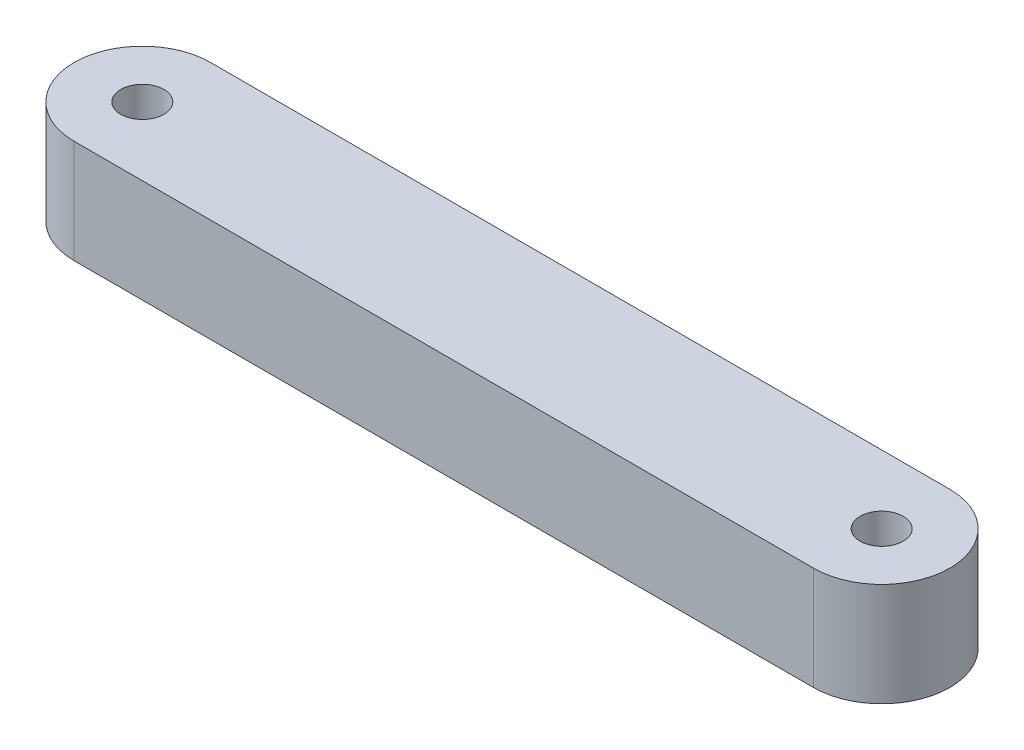
ISO-10303-21;
HEADER;
FILE_DESCRIPTION(('STEP AP214'),'2;1');
FILE_NAME('part.step','',(''),(''),'','','');
FILE_SCHEMA(('AUTOMOTIVE_DESIGN { 1 0 10303 214 1 1 1 1 }'));
ENDSEC;
DATA;
#1=APPLICATION_CONTEXT('core data for automotive mechanical design processes');
#2=APPLICATION_PROTOCOL_DEFINITION('international standard','automotive_design',2000,#1);
#3=PRODUCT_CONTEXT('',#1,'mechanical');
#4=PRODUCT('Part','Part','',(#3));
#5=PRODUCT_RELATED_PRODUCT_CATEGORY('part','',(#4));
#6=PRODUCT_DEFINITION_FORMATION('','',#4);
#7=PRODUCT_DEFINITION_CONTEXT('part definition',#1,'design');
#8=PRODUCT_DEFINITION('design','',#6,#7);
#9=PRODUCT_DEFINITION_SHAPE('','',#8);
#10=(LENGTH_UNIT() NAMED_UNIT(*) SI_UNIT(.MILLI.,.METRE.));
#11=(NAMED_UNIT(*) PLANE_ANGLE_UNIT() SI_UNIT($,.RADIAN.));
#12=(NAMED_UNIT(*) SI_UNIT($,.STERADIAN.) SOLID_ANGLE_UNIT());
#13=UNCERTAINTY_MEASURE_WITH_UNIT(LENGTH_MEASURE(1.E-05),#10,'distance_accuracy_value','');
#14=(GEOMETRIC_REPRESENTATION_CONTEXT(3) GLOBAL_UNCERTAINTY_ASSIGNED_CONTEXT((#13)) GLOBAL_UNIT_ASSIGNED_CONTEXT((#10,
#11,#12)) REPRESENTATION_CONTEXT('',''));
#15=CARTESIAN_POINT('',(0.,0.,0.));
#16=DIRECTION('',(0.,0.,1.));
#17=DIRECTION('',(1.,0.,0.));
#18=AXIS2_PLACEMENT_3D('',#15,#16,#17);
#19=CARTESIAN_POINT('',(0.,12.7,0.));
#20=DIRECTION('',(0.,1.,0.));
#21=DIRECTION('',(0.,0.,1.));
#22=AXIS2_PLACEMENT_3D('',#19,#20,#21);
#23=PLANE('',#22);
#24=CARTESIAN_POINT('',(0.,12.7,0.));
#25=DIRECTION('',(0.,1.,0.));
#26=DIRECTION('',(0.,0.,1.));
#27=AXIS2_PLACEMENT_3D('',#24,#25,#26);
#28=CIRCLE('',#27,2.65);
#29=CARTESIAN_POINT('',(0.,12.7,2.65));
#30=VERTEX_POINT('',#29);
#31=EDGE_CURVE('E113',#30,#30,#28,.T.);
#32=ORIENTED_EDGE('',*,*,#31,.F.);
#33=EDGE_LOOP('',(#32));
#34=FACE_BOUND('',#33,.T.);
#35=CARTESIAN_POINT('',(0.,12.7,0.));
#36=DIRECTION('',(0.,1.,0.));
#37=DIRECTION('',(0.,0.,1.));
#38=AXIS2_PLACEMENT_3D('',#35,#36,#37);
#39=CIRCLE('',#38,8.382);
#40=CARTESIAN_POINT('',(0.,12.7,-8.382));
#41=VERTEX_POINT('',#40);
#42=CARTESIAN_POINT('',(0.,12.7,8.382));
#43=VERTEX_POINT('',#42);
#44=EDGE_CURVE('E93',#41,#43,#39,.T.);
#45=ORIENTED_EDGE('',*,*,#44,.T.);
#46=DIRECTION('',(1.,0.,0.));
#47=VECTOR('',#46,1.);
#48=CARTESIAN_POINT('',(0.,12.7,8.382));
#49=LINE('',#48,#47);
#50=CARTESIAN_POINT('',(90.805,12.7,8.382));
#51=VERTEX_POINT('',#50);
#52=EDGE_CURVE('E88',#43,#51,#49,.T.);
#53=ORIENTED_EDGE('',*,*,#52,.T.);
#54=CARTESIAN_POINT('',(90.805,12.7,0.));
#55=DIRECTION('',(0.,1.,0.));
#56=DIRECTION('',(0.,0.,1.));
#57=AXIS2_PLACEMENT_3D('',#54,#55,#56);
#58=CIRCLE('',#57,8.382);
#59=CARTESIAN_POINT('',(90.805,12.7,-8.382));
#60=VERTEX_POINT('',#59);
#61=EDGE_CURVE('E91',#51,#60,#58,.T.);
#62=ORIENTED_EDGE('',*,*,#61,.T.);
#63=DIRECTION('',(-1.,0.,0.));
#64=VECTOR('',#63,1.);
#65=CARTESIAN_POINT('',(0.,12.7,-8.382));
#66=LINE('',#65,#64);
#67=EDGE_CURVE('E58',#60,#41,#66,.T.);
#68=ORIENTED_EDGE('',*,*,#67,.T.);
#69=EDGE_LOOP('',(#45,#53,#62,#68));
#70=FACE_BOUND('',#69,.T.);
#71=CARTESIAN_POINT('',(90.805,12.7,0.));
#72=DIRECTION('',(0.,1.,0.));
#73=DIRECTION('',(0.,0.,1.));
#74=AXIS2_PLACEMENT_3D('',#71,#72,#73);
#75=CIRCLE('',#74,2.65);
#76=CARTESIAN_POINT('',(90.805,12.7,2.65));
#77=VERTEX_POINT('',#76);
#78=EDGE_CURVE('E135',#77,#77,#75,.T.);
#79=ORIENTED_EDGE('',*,*,#78,.F.);
#80=EDGE_LOOP('',(#79));
#81=FACE_BOUND('',#80,.T.);
#82=ADVANCED_FACE('F40',(#34,#70,#81),#23,.T.);
#83=CARTESIAN_POINT('',(0.,0.,0.));
#84=DIRECTION('',(0.,1.,0.));
#85=DIRECTION('',(0.,0.,1.));
#86=AXIS2_PLACEMENT_3D('',#83,#84,#85);
#87=PLANE('',#86);
#88=CARTESIAN_POINT('',(0.,0.,0.));
#89=DIRECTION('',(0.,1.,0.));
#90=DIRECTION('',(0.,0.,1.));
#91=AXIS2_PLACEMENT_3D('',#88,#89,#90);
#92=CIRCLE('',#91,8.382);
#93=CARTESIAN_POINT('',(0.,0.,-8.382));
#94=VERTEX_POINT('',#93);
#95=CARTESIAN_POINT('',(0.,0.,8.382));
#96=VERTEX_POINT('',#95);
#97=EDGE_CURVE('E109',#94,#96,#92,.T.);
#98=ORIENTED_EDGE('',*,*,#97,.F.);
#99=DIRECTION('',(-1.,0.,0.));
#100=VECTOR('',#99,1.);
#101=CARTESIAN_POINT('',(0.,0.,-8.382));
#102=LINE('',#101,#100);
#103=CARTESIAN_POINT('',(90.805,0.,-8.382));
#104=VERTEX_POINT('',#103);
#105=EDGE_CURVE('E81',#104,#94,#102,.T.);
#106=ORIENTED_EDGE('',*,*,#105,.F.);
#107=CARTESIAN_POINT('',(90.805,0.,0.));
#108=DIRECTION('',(0.,1.,0.));
#109=DIRECTION('',(0.,0.,1.));
#110=AXIS2_PLACEMENT_3D('',#107,#108,#109);
#111=CIRCLE('',#110,8.382);
#112=CARTESIAN_POINT('',(90.805,0.,8.382));
#113=VERTEX_POINT('',#112);
#114=EDGE_CURVE('E75',#113,#104,#111,.T.);
#115=ORIENTED_EDGE('',*,*,#114,.F.);
#116=DIRECTION('',(1.,0.,0.));
#117=VECTOR('',#116,1.);
#118=CARTESIAN_POINT('',(0.,0.,8.382));
#119=LINE('',#118,#117);
#120=EDGE_CURVE('E98',#96,#113,#119,.T.);
#121=ORIENTED_EDGE('',*,*,#120,.F.);
#122=EDGE_LOOP('',(#98,#106,#115,#121));
#123=FACE_BOUND('',#122,.T.);
#124=CARTESIAN_POINT('',(0.,0.,0.));
#125=DIRECTION('',(0.,1.,0.));
#126=DIRECTION('',(0.,0.,1.));
#127=AXIS2_PLACEMENT_3D('',#124,#125,#126);
#128=CIRCLE('',#127,2.65);
#129=CARTESIAN_POINT('',(0.,0.,2.65));
#130=VERTEX_POINT('',#129);
#131=EDGE_CURVE('E131',#130,#130,#128,.T.);
#132=ORIENTED_EDGE('',*,*,#131,.T.);
#133=EDGE_LOOP('',(#132));
#134=FACE_BOUND('',#133,.T.);
#135=CARTESIAN_POINT('',(90.805,0.,0.));
#136=DIRECTION('',(0.,1.,0.));
#137=DIRECTION('',(0.,0.,1.));
#138=AXIS2_PLACEMENT_3D('',#135,#136,#137);
#139=CIRCLE('',#138,2.65);
#140=CARTESIAN_POINT('',(90.805,0.,2.65));
#141=VERTEX_POINT('',#140);
#142=EDGE_CURVE('E139',#141,#141,#139,.T.);
#143=ORIENTED_EDGE('',*,*,#142,.T.);
#144=EDGE_LOOP('',(#143));
#145=FACE_BOUND('',#144,.T.);
#146=ADVANCED_FACE('F126',(#123,#134,#145),#87,.F.);
#147=CARTESIAN_POINT('',(0.,12.7,0.));
#148=DIRECTION('',(0.,-1.,0.));
#149=DIRECTION('',(0.,0.,-1.));
#150=AXIS2_PLACEMENT_3D('',#147,#148,#149);
#151=CYLINDRICAL_SURFACE('',#150,8.382);
#152=ORIENTED_EDGE('',*,*,#97,.T.);
#153=DIRECTION('',(0.,-1.,0.));
#154=VECTOR('',#153,1.);
#155=CARTESIAN_POINT('',(0.,12.7,8.382));
#156=LINE('',#155,#154);
#157=EDGE_CURVE('E11',#43,#96,#156,.T.);
#158=ORIENTED_EDGE('',*,*,#157,.F.);
#159=ORIENTED_EDGE('',*,*,#44,.F.);
#160=DIRECTION('',(0.,-1.,0.));
#161=VECTOR('',#160,1.);
#162=CARTESIAN_POINT('',(0.,12.7,-8.382));
#163=LINE('',#162,#161);
#164=EDGE_CURVE('E105',#41,#94,#163,.T.);
#165=ORIENTED_EDGE('',*,*,#164,.T.);
#166=EDGE_LOOP('',(#152,#158,#159,#165));
#167=FACE_BOUND('',#166,.T.);
#168=ADVANCED_FACE('F42',(#167),#151,.T.);
#169=CARTESIAN_POINT('',(0.,12.7,8.382));
#170=DIRECTION('',(0.,0.,-1.));
#171=DIRECTION('',(-1.,0.,0.));
#172=AXIS2_PLACEMENT_3D('',#169,#170,#171);
#173=PLANE('',#172);
#174=ORIENTED_EDGE('',*,*,#120,.T.);
#175=DIRECTION('',(0.,-1.,0.));
#176=VECTOR('',#175,1.);
#177=CARTESIAN_POINT('',(90.805,12.7,8.382));
#178=LINE('',#177,#176);
#179=EDGE_CURVE('E50',#51,#113,#178,.T.);
#180=ORIENTED_EDGE('',*,*,#179,.F.);
#181=ORIENTED_EDGE('',*,*,#52,.F.);
#182=ORIENTED_EDGE('',*,*,#157,.T.);
#183=EDGE_LOOP('',(#174,#180,#181,#182));
#184=FACE_BOUND('',#183,.T.);
#185=ADVANCED_FACE('F97',(#184),#173,.F.);
#186=CARTESIAN_POINT('',(90.805,12.7,0.));
#187=DIRECTION('',(0.,-1.,0.));
#188=DIRECTION('',(0.,0.,-1.));
#189=AXIS2_PLACEMENT_3D('',#186,#187,#188);
#190=CYLINDRICAL_SURFACE('',#189,8.382);
#191=ORIENTED_EDGE('',*,*,#114,.T.);
#192=DIRECTION('',(0.,-1.,0.));
#193=VECTOR('',#192,1.);
#194=CARTESIAN_POINT('',(90.805,12.7,-8.382));
#195=LINE('',#194,#193);
#196=EDGE_CURVE('E100',#60,#104,#195,.T.);
#197=ORIENTED_EDGE('',*,*,#196,.F.);
#198=ORIENTED_EDGE('',*,*,#61,.F.);
#199=ORIENTED_EDGE('',*,*,#179,.T.);
#200=EDGE_LOOP('',(#191,#197,#198,#199));
#201=FACE_BOUND('',#200,.T.);
#202=ADVANCED_FACE('F101',(#201),#190,.T.);
#203=CARTESIAN_POINT('',(0.,12.7,-8.382));
#204=DIRECTION('',(0.,0.,1.));
#205=DIRECTION('',(1.,0.,0.));
#206=AXIS2_PLACEMENT_3D('',#203,#204,#205);
#207=PLANE('',#206);
#208=ORIENTED_EDGE('',*,*,#105,.T.);
#209=ORIENTED_EDGE('',*,*,#164,.F.);
#210=ORIENTED_EDGE('',*,*,#67,.F.);
#211=ORIENTED_EDGE('',*,*,#196,.T.);
#212=EDGE_LOOP('',(#208,#209,#210,#211));
#213=FACE_BOUND('',#212,.T.);
#214=ADVANCED_FACE('F123',(#213),#207,.F.);
#215=CARTESIAN_POINT('',(0.,12.7,0.));
#216=DIRECTION('',(0.,-1.,0.));
#217=DIRECTION('',(0.,0.,-1.));
#218=AXIS2_PLACEMENT_3D('',#215,#216,#217);
#219=CYLINDRICAL_SURFACE('',#218,2.65);
#220=ORIENTED_EDGE('',*,*,#31,.T.);
#221=EDGE_LOOP('',(#220));
#222=FACE_BOUND('',#221,.T.);
#223=ORIENTED_EDGE('',*,*,#131,.F.);
#224=EDGE_LOOP('',(#223));
#225=FACE_BOUND('',#224,.T.);
#226=ADVANCED_FACE('F158',(#222,#225),#219,.F.);
#227=CARTESIAN_POINT('',(90.805,12.7,0.));
#228=DIRECTION('',(0.,-1.,0.));
#229=DIRECTION('',(0.,0.,-1.));
#230=AXIS2_PLACEMENT_3D('',#227,#228,#229);
#231=CYLINDRICAL_SURFACE('',#230,2.65);
#232=ORIENTED_EDGE('',*,*,#78,.T.);
#233=EDGE_LOOP('',(#232));
#234=FACE_BOUND('',#233,.T.);
#235=ORIENTED_EDGE('',*,*,#142,.F.);
#236=EDGE_LOOP('',(#235));
#237=FACE_BOUND('',#236,.T.);
#238=ADVANCED_FACE('F147',(#234,#237),#231,.F.);
#239=CLOSED_SHELL('',(#82,#146,#168,#185,#202,#214,#226,#238));
#240=MANIFOLD_SOLID_BREP('B2',#239);
#241=ADVANCED_BREP_SHAPE_REPRESENTATION('',(#18,#240),#14);
#242=SHAPE_DEFINITION_REPRESENTATION(#9,#241);
ENDSEC;
END-ISO-10303-21;
